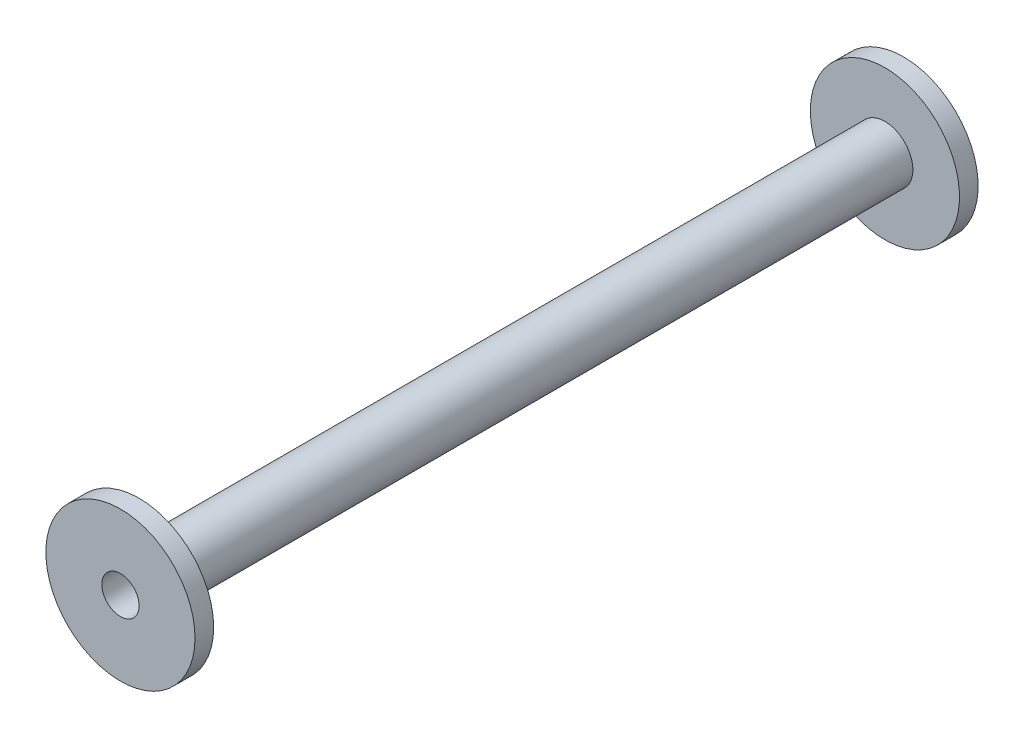
ISO-10303-21;
HEADER;
FILE_DESCRIPTION(('STEP AP214'),'2;1');
FILE_NAME('part.step','',(''),(''),'','','');
FILE_SCHEMA(('AUTOMOTIVE_DESIGN { 1 0 10303 214 1 1 1 1 }'));
ENDSEC;
DATA;
#1=APPLICATION_CONTEXT('core data for automotive mechanical design processes');
#2=APPLICATION_PROTOCOL_DEFINITION('international standard','automotive_design',2000,#1);
#3=PRODUCT_CONTEXT('',#1,'mechanical');
#4=PRODUCT('Part','Part','',(#3));
#5=PRODUCT_RELATED_PRODUCT_CATEGORY('part','',(#4));
#6=PRODUCT_DEFINITION_FORMATION('','',#4);
#7=PRODUCT_DEFINITION_CONTEXT('part definition',#1,'design');
#8=PRODUCT_DEFINITION('design','',#6,#7);
#9=PRODUCT_DEFINITION_SHAPE('','',#8);
#10=(LENGTH_UNIT() NAMED_UNIT(*) SI_UNIT(.MILLI.,.METRE.));
#11=(NAMED_UNIT(*) PLANE_ANGLE_UNIT() SI_UNIT($,.RADIAN.));
#12=(NAMED_UNIT(*) SI_UNIT($,.STERADIAN.) SOLID_ANGLE_UNIT());
#13=UNCERTAINTY_MEASURE_WITH_UNIT(LENGTH_MEASURE(1.E-05),#10,'distance_accuracy_value','');
#14=(GEOMETRIC_REPRESENTATION_CONTEXT(3) GLOBAL_UNCERTAINTY_ASSIGNED_CONTEXT((#13)) GLOBAL_UNIT_ASSIGNED_CONTEXT((#10,
#11,#12)) REPRESENTATION_CONTEXT('',''));
#15=CARTESIAN_POINT('',(0.,0.,0.));
#16=DIRECTION('',(0.,0.,1.));
#17=DIRECTION('',(1.,0.,0.));
#18=AXIS2_PLACEMENT_3D('',#15,#16,#17);
#19=CARTESIAN_POINT('',(0.,0.,266.7));
#20=DIRECTION('',(0.,0.,-1.));
#21=DIRECTION('',(-1.,0.,0.));
#22=AXIS2_PLACEMENT_3D('',#19,#20,#21);
#23=CYLINDRICAL_SURFACE('',#22,19.05);
#24=CARTESIAN_POINT('',(0.,0.,254.));
#25=DIRECTION('',(0.,0.,1.));
#26=DIRECTION('',(1.,0.,0.));
#27=AXIS2_PLACEMENT_3D('',#24,#25,#26);
#28=CIRCLE('',#27,19.05);
#29=CARTESIAN_POINT('',(19.05,0.,254.));
#30=VERTEX_POINT('',#29);
#31=EDGE_CURVE('E36',#30,#30,#28,.T.);
#32=ORIENTED_EDGE('',*,*,#31,.F.);
#33=EDGE_LOOP('',(#32));
#34=FACE_BOUND('',#33,.T.);
#35=CARTESIAN_POINT('',(0.,0.,-254.));
#36=DIRECTION('',(0.,0.,-1.));
#37=DIRECTION('',(-1.,0.,0.));
#38=AXIS2_PLACEMENT_3D('',#35,#36,#37);
#39=CIRCLE('',#38,19.05);
#40=CARTESIAN_POINT('',(-19.05,0.,-254.));
#41=VERTEX_POINT('',#40);
#42=EDGE_CURVE('E10',#41,#41,#39,.T.);
#43=ORIENTED_EDGE('',*,*,#42,.F.);
#44=EDGE_LOOP('',(#43));
#45=FACE_BOUND('',#44,.T.);
#46=ADVANCED_FACE('F29',(#34,#45),#23,.T.);
#47=CARTESIAN_POINT('',(0.,0.,266.7));
#48=DIRECTION('',(0.,0.,1.));
#49=DIRECTION('',(1.,0.,0.));
#50=AXIS2_PLACEMENT_3D('',#47,#48,#49);
#51=PLANE('',#50);
#52=CARTESIAN_POINT('',(0.,0.,266.7));
#53=DIRECTION('',(0.,0.,1.));
#54=DIRECTION('',(1.,0.,0.));
#55=AXIS2_PLACEMENT_3D('',#52,#53,#54);
#56=CIRCLE('',#55,12.7);
#57=CARTESIAN_POINT('',(12.7,0.,266.7));
#58=VERTEX_POINT('',#57);
#59=EDGE_CURVE('E41',#58,#58,#56,.T.);
#60=ORIENTED_EDGE('',*,*,#59,.F.);
#61=EDGE_LOOP('',(#60));
#62=FACE_BOUND('',#61,.T.);
#63=CARTESIAN_POINT('',(0.,0.,266.7));
#64=DIRECTION('',(0.,0.,1.));
#65=DIRECTION('',(1.,0.,0.));
#66=AXIS2_PLACEMENT_3D('',#63,#64,#65);
#67=CIRCLE('',#66,50.8);
#68=CARTESIAN_POINT('',(50.8,0.,266.7));
#69=VERTEX_POINT('',#68);
#70=EDGE_CURVE('E50',#69,#69,#67,.T.);
#71=ORIENTED_EDGE('',*,*,#70,.T.);
#72=EDGE_LOOP('',(#71));
#73=FACE_BOUND('',#72,.T.);
#74=ADVANCED_FACE('F73',(#62,#73),#51,.T.);
#75=CARTESIAN_POINT('',(0.,0.,-266.7));
#76=DIRECTION('',(0.,0.,1.));
#77=DIRECTION('',(1.,0.,0.));
#78=AXIS2_PLACEMENT_3D('',#75,#76,#77);
#79=PLANE('',#78);
#80=CARTESIAN_POINT('',(0.,0.,-266.7));
#81=DIRECTION('',(0.,0.,1.));
#82=DIRECTION('',(1.,0.,0.));
#83=AXIS2_PLACEMENT_3D('',#80,#81,#82);
#84=CIRCLE('',#83,12.7);
#85=CARTESIAN_POINT('',(12.7,0.,-266.7));
#86=VERTEX_POINT('',#85);
#87=EDGE_CURVE('E32',#86,#86,#84,.T.);
#88=ORIENTED_EDGE('',*,*,#87,.T.);
#89=EDGE_LOOP('',(#88));
#90=FACE_BOUND('',#89,.T.);
#91=CARTESIAN_POINT('',(0.,0.,-266.7));
#92=DIRECTION('',(0.,0.,-1.));
#93=DIRECTION('',(-1.,0.,0.));
#94=AXIS2_PLACEMENT_3D('',#91,#92,#93);
#95=CIRCLE('',#94,50.8);
#96=CARTESIAN_POINT('',(-50.8,0.,-266.7));
#97=VERTEX_POINT('',#96);
#98=EDGE_CURVE('E45',#97,#97,#95,.T.);
#99=ORIENTED_EDGE('',*,*,#98,.T.);
#100=EDGE_LOOP('',(#99));
#101=FACE_BOUND('',#100,.T.);
#102=ADVANCED_FACE('F59',(#90,#101),#79,.F.);
#103=CARTESIAN_POINT('',(0.,0.,266.7));
#104=DIRECTION('',(0.,0.,-1.));
#105=DIRECTION('',(-1.,0.,0.));
#106=AXIS2_PLACEMENT_3D('',#103,#104,#105);
#107=CYLINDRICAL_SURFACE('',#106,12.7);
#108=ORIENTED_EDGE('',*,*,#87,.F.);
#109=EDGE_LOOP('',(#108));
#110=FACE_BOUND('',#109,.T.);
#111=ORIENTED_EDGE('',*,*,#59,.T.);
#112=EDGE_LOOP('',(#111));
#113=FACE_BOUND('',#112,.T.);
#114=ADVANCED_FACE('F62',(#110,#113),#107,.F.);
#115=CARTESIAN_POINT('',(0.,0.,254.));
#116=DIRECTION('',(0.,0.,1.));
#117=DIRECTION('',(1.,0.,0.));
#118=AXIS2_PLACEMENT_3D('',#115,#116,#117);
#119=PLANE('',#118);
#120=CARTESIAN_POINT('',(0.,0.,254.));
#121=DIRECTION('',(0.,0.,1.));
#122=DIRECTION('',(1.,0.,0.));
#123=AXIS2_PLACEMENT_3D('',#120,#121,#122);
#124=CIRCLE('',#123,50.8);
#125=CARTESIAN_POINT('',(50.8,0.,254.));
#126=VERTEX_POINT('',#125);
#127=EDGE_CURVE('E47',#126,#126,#124,.T.);
#128=ORIENTED_EDGE('',*,*,#127,.F.);
#129=EDGE_LOOP('',(#128));
#130=FACE_BOUND('',#129,.T.);
#131=ORIENTED_EDGE('',*,*,#31,.T.);
#132=EDGE_LOOP('',(#131));
#133=FACE_BOUND('',#132,.T.);
#134=ADVANCED_FACE('F64',(#130,#133),#119,.F.);
#135=CARTESIAN_POINT('',(0.,0.,254.));
#136=DIRECTION('',(0.,0.,1.));
#137=DIRECTION('',(1.,0.,0.));
#138=AXIS2_PLACEMENT_3D('',#135,#136,#137);
#139=CYLINDRICAL_SURFACE('',#138,50.8);
#140=ORIENTED_EDGE('',*,*,#127,.T.);
#141=EDGE_LOOP('',(#140));
#142=FACE_BOUND('',#141,.T.);
#143=ORIENTED_EDGE('',*,*,#70,.F.);
#144=EDGE_LOOP('',(#143));
#145=FACE_BOUND('',#144,.T.);
#146=ADVANCED_FACE('F70',(#142,#145),#139,.T.);
#147=CARTESIAN_POINT('',(0.,0.,-254.));
#148=DIRECTION('',(0.,0.,-1.));
#149=DIRECTION('',(-1.,0.,0.));
#150=AXIS2_PLACEMENT_3D('',#147,#148,#149);
#151=PLANE('',#150);
#152=CARTESIAN_POINT('',(0.,0.,-254.));
#153=DIRECTION('',(0.,0.,-1.));
#154=DIRECTION('',(-1.,0.,0.));
#155=AXIS2_PLACEMENT_3D('',#152,#153,#154);
#156=CIRCLE('',#155,50.8);
#157=CARTESIAN_POINT('',(-50.8,0.,-254.));
#158=VERTEX_POINT('',#157);
#159=EDGE_CURVE('E52',#158,#158,#156,.T.);
#160=ORIENTED_EDGE('',*,*,#159,.F.);
#161=EDGE_LOOP('',(#160));
#162=FACE_BOUND('',#161,.T.);
#163=ORIENTED_EDGE('',*,*,#42,.T.);
#164=EDGE_LOOP('',(#163));
#165=FACE_BOUND('',#164,.T.);
#166=ADVANCED_FACE('F91',(#162,#165),#151,.F.);
#167=CARTESIAN_POINT('',(0.,0.,-254.));
#168=DIRECTION('',(0.,0.,-1.));
#169=DIRECTION('',(-1.,0.,0.));
#170=AXIS2_PLACEMENT_3D('',#167,#168,#169);
#171=CYLINDRICAL_SURFACE('',#170,50.8);
#172=ORIENTED_EDGE('',*,*,#159,.T.);
#173=EDGE_LOOP('',(#172));
#174=FACE_BOUND('',#173,.T.);
#175=ORIENTED_EDGE('',*,*,#98,.F.);
#176=EDGE_LOOP('',(#175));
#177=FACE_BOUND('',#176,.T.);
#178=ADVANCED_FACE('F96',(#174,#177),#171,.T.);
#179=CLOSED_SHELL('',(#46,#74,#102,#114,#134,#146,#166,#178));
#180=MANIFOLD_SOLID_BREP('B2',#179);
#181=ADVANCED_BREP_SHAPE_REPRESENTATION('',(#18,#180),#14);
#182=SHAPE_DEFINITION_REPRESENTATION(#9,#181);
ENDSEC;
END-ISO-10303-21;
